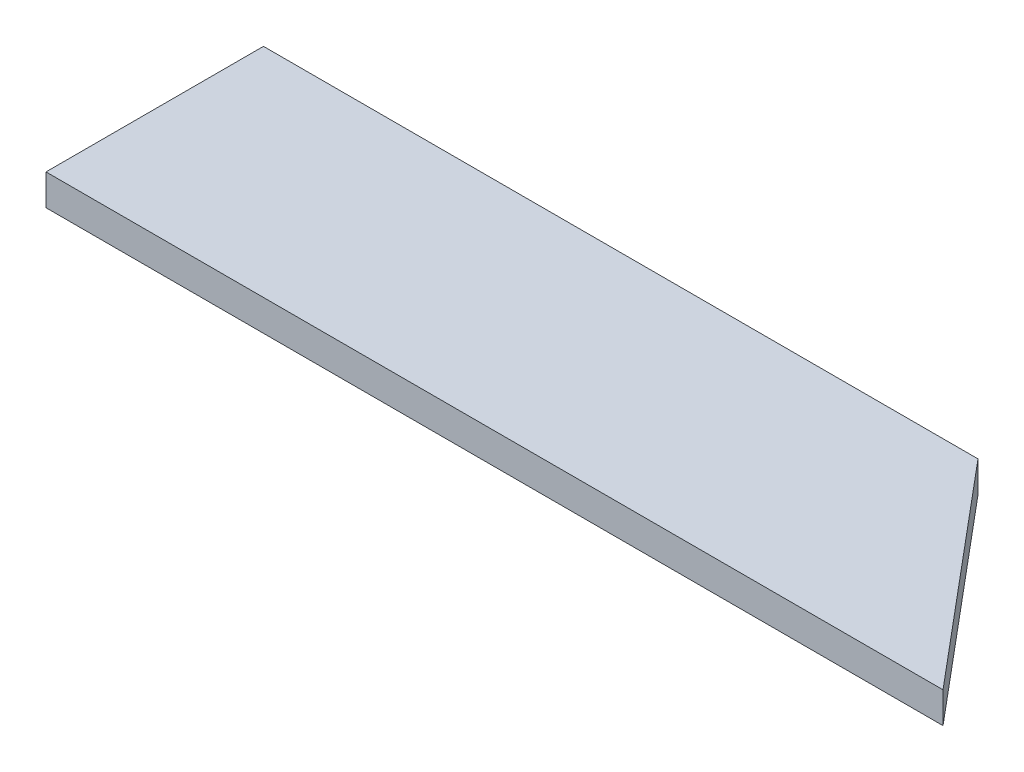
ISO-10303-21;
HEADER;
FILE_DESCRIPTION(('STEP AP214'),'2;1');
FILE_NAME('part.step','',(''),(''),'','','');
FILE_SCHEMA(('AUTOMOTIVE_DESIGN { 1 0 10303 214 1 1 1 1 }'));
ENDSEC;
DATA;
#1=APPLICATION_CONTEXT('core data for automotive mechanical design processes');
#2=APPLICATION_PROTOCOL_DEFINITION('international standard','automotive_design',2000,#1);
#3=PRODUCT_CONTEXT('',#1,'mechanical');
#4=PRODUCT('Part','Part','',(#3));
#5=PRODUCT_RELATED_PRODUCT_CATEGORY('part','',(#4));
#6=PRODUCT_DEFINITION_FORMATION('','',#4);
#7=PRODUCT_DEFINITION_CONTEXT('part definition',#1,'design');
#8=PRODUCT_DEFINITION('design','',#6,#7);
#9=PRODUCT_DEFINITION_SHAPE('','',#8);
#10=(LENGTH_UNIT() NAMED_UNIT(*) SI_UNIT(.MILLI.,.METRE.));
#11=(NAMED_UNIT(*) PLANE_ANGLE_UNIT() SI_UNIT($,.RADIAN.));
#12=(NAMED_UNIT(*) SI_UNIT($,.STERADIAN.) SOLID_ANGLE_UNIT());
#13=UNCERTAINTY_MEASURE_WITH_UNIT(LENGTH_MEASURE(1.E-05),#10,'distance_accuracy_value','');
#14=(GEOMETRIC_REPRESENTATION_CONTEXT(3) GLOBAL_UNCERTAINTY_ASSIGNED_CONTEXT((#13)) GLOBAL_UNIT_ASSIGNED_CONTEXT((#10,
#11,#12)) REPRESENTATION_CONTEXT('',''));
#15=CARTESIAN_POINT('',(0.,0.,0.));
#16=DIRECTION('',(0.,0.,1.));
#17=DIRECTION('',(1.,0.,0.));
#18=AXIS2_PLACEMENT_3D('',#15,#16,#17);
#19=CARTESIAN_POINT('',(-115.,10.,-35.));
#20=DIRECTION('',(0.,0.,1.));
#21=DIRECTION('',(1.,0.,0.));
#22=AXIS2_PLACEMENT_3D('',#19,#20,#21);
#23=PLANE('',#22);
#24=DIRECTION('',(-1.,0.,0.));
#25=VECTOR('',#24,1.);
#26=CARTESIAN_POINT('',(-115.,0.,-35.));
#27=LINE('',#26,#25);
#28=CARTESIAN_POINT('',(115.,0.,-35.));
#29=VERTEX_POINT('',#28);
#30=CARTESIAN_POINT('',(-115.,0.,-35.));
#31=VERTEX_POINT('',#30);
#32=EDGE_CURVE('E107',#29,#31,#27,.T.);
#33=ORIENTED_EDGE('',*,*,#32,.T.);
#34=DIRECTION('',(0.,-1.,0.));
#35=VECTOR('',#34,1.);
#36=CARTESIAN_POINT('',(-115.,10.,-35.));
#37=LINE('',#36,#35);
#38=CARTESIAN_POINT('',(-115.,10.,-35.));
#39=VERTEX_POINT('',#38);
#40=EDGE_CURVE('E11',#39,#31,#37,.T.);
#41=ORIENTED_EDGE('',*,*,#40,.F.);
#42=DIRECTION('',(-1.,0.,0.));
#43=VECTOR('',#42,1.);
#44=CARTESIAN_POINT('',(-115.,10.,-35.));
#45=LINE('',#44,#43);
#46=CARTESIAN_POINT('',(115.,10.,-35.));
#47=VERTEX_POINT('',#46);
#48=EDGE_CURVE('E90',#47,#39,#45,.T.);
#49=ORIENTED_EDGE('',*,*,#48,.F.);
#50=DIRECTION('',(0.,-1.,0.));
#51=VECTOR('',#50,1.);
#52=CARTESIAN_POINT('',(115.,10.,-35.));
#53=LINE('',#52,#51);
#54=EDGE_CURVE('E103',#47,#29,#53,.T.);
#55=ORIENTED_EDGE('',*,*,#54,.T.);
#56=EDGE_LOOP('',(#33,#41,#49,#55));
#57=FACE_BOUND('',#56,.T.);
#58=ADVANCED_FACE('F39',(#57),#23,.F.);
#59=CARTESIAN_POINT('',(-115.,10.,35.));
#60=DIRECTION('',(1.,0.,0.));
#61=DIRECTION('',(0.,0.,-1.));
#62=AXIS2_PLACEMENT_3D('',#59,#60,#61);
#63=PLANE('',#62);
#64=DIRECTION('',(0.,0.,1.));
#65=VECTOR('',#64,1.);
#66=CARTESIAN_POINT('',(-115.,0.,35.));
#67=LINE('',#66,#65);
#68=CARTESIAN_POINT('',(-115.,0.,35.));
#69=VERTEX_POINT('',#68);
#70=EDGE_CURVE('E96',#31,#69,#67,.T.);
#71=ORIENTED_EDGE('',*,*,#70,.T.);
#72=DIRECTION('',(0.,-1.,0.));
#73=VECTOR('',#72,1.);
#74=CARTESIAN_POINT('',(-115.,10.,35.));
#75=LINE('',#74,#73);
#76=CARTESIAN_POINT('',(-115.,10.,35.));
#77=VERTEX_POINT('',#76);
#78=EDGE_CURVE('E48',#77,#69,#75,.T.);
#79=ORIENTED_EDGE('',*,*,#78,.F.);
#80=DIRECTION('',(0.,0.,1.));
#81=VECTOR('',#80,1.);
#82=CARTESIAN_POINT('',(-115.,10.,35.));
#83=LINE('',#82,#81);
#84=EDGE_CURVE('E85',#39,#77,#83,.T.);
#85=ORIENTED_EDGE('',*,*,#84,.F.);
#86=ORIENTED_EDGE('',*,*,#40,.T.);
#87=EDGE_LOOP('',(#71,#79,#85,#86));
#88=FACE_BOUND('',#87,.T.);
#89=ADVANCED_FACE('F95',(#88),#63,.F.);
#90=CARTESIAN_POINT('',(173.73697418241,10.,35.));
#91=DIRECTION('',(0.,0.,-1.));
#92=DIRECTION('',(-1.,0.,0.));
#93=AXIS2_PLACEMENT_3D('',#90,#91,#92);
#94=PLANE('',#93);
#95=DIRECTION('',(1.,0.,0.));
#96=VECTOR('',#95,1.);
#97=CARTESIAN_POINT('',(173.73697418241,0.,35.));
#98=LINE('',#97,#96);
#99=CARTESIAN_POINT('',(173.73697418241,0.,35.));
#100=VERTEX_POINT('',#99);
#101=EDGE_CURVE('E72',#69,#100,#98,.T.);
#102=ORIENTED_EDGE('',*,*,#101,.T.);
#103=DIRECTION('',(0.,-1.,0.));
#104=VECTOR('',#103,1.);
#105=CARTESIAN_POINT('',(173.73697418241,10.,35.));
#106=LINE('',#105,#104);
#107=CARTESIAN_POINT('',(173.73697418241,10.,35.));
#108=VERTEX_POINT('',#107);
#109=EDGE_CURVE('E98',#108,#100,#106,.T.);
#110=ORIENTED_EDGE('',*,*,#109,.F.);
#111=DIRECTION('',(1.,0.,0.));
#112=VECTOR('',#111,1.);
#113=CARTESIAN_POINT('',(-115.,10.,35.));
#114=LINE('',#113,#112);
#115=EDGE_CURVE('E88',#77,#108,#114,.T.);
#116=ORIENTED_EDGE('',*,*,#115,.F.);
#117=ORIENTED_EDGE('',*,*,#78,.T.);
#118=EDGE_LOOP('',(#102,#110,#116,#117));
#119=FACE_BOUND('',#118,.T.);
#120=ADVANCED_FACE('F99',(#119),#94,.F.);
#121=CARTESIAN_POINT('',(115.,10.,-35.));
#122=DIRECTION('',(-0.766044443118974,0.,0.642787609686544));
#123=DIRECTION('',(0.642787609686544,0.,0.766044443118974));
#124=AXIS2_PLACEMENT_3D('',#121,#122,#123);
#125=PLANE('',#124);
#126=DIRECTION('',(-0.642787609686544,0.,-0.766044443118974));
#127=VECTOR('',#126,1.);
#128=CARTESIAN_POINT('',(115.,0.,-35.));
#129=LINE('',#128,#127);
#130=EDGE_CURVE('E78',#100,#29,#129,.T.);
#131=ORIENTED_EDGE('',*,*,#130,.T.);
#132=ORIENTED_EDGE('',*,*,#54,.F.);
#133=DIRECTION('',(-0.642787609686544,0.,-0.766044443118974));
#134=VECTOR('',#133,1.);
#135=CARTESIAN_POINT('',(115.,10.,-35.));
#136=LINE('',#135,#134);
#137=EDGE_CURVE('E56',#108,#47,#136,.T.);
#138=ORIENTED_EDGE('',*,*,#137,.F.);
#139=ORIENTED_EDGE('',*,*,#109,.T.);
#140=EDGE_LOOP('',(#131,#132,#138,#139));
#141=FACE_BOUND('',#140,.T.);
#142=ADVANCED_FACE('F120',(#141),#125,.F.);
#143=CARTESIAN_POINT('',(0.,10.,0.));
#144=DIRECTION('',(0.,1.,0.));
#145=DIRECTION('',(0.,0.,1.));
#146=AXIS2_PLACEMENT_3D('',#143,#144,#145);
#147=PLANE('',#146);
#148=ORIENTED_EDGE('',*,*,#48,.T.);
#149=ORIENTED_EDGE('',*,*,#84,.T.);
#150=ORIENTED_EDGE('',*,*,#115,.T.);
#151=ORIENTED_EDGE('',*,*,#137,.T.);
#152=EDGE_LOOP('',(#148,#149,#150,#151));
#153=FACE_BOUND('',#152,.T.);
#154=ADVANCED_FACE('F86',(#153),#147,.T.);
#155=CARTESIAN_POINT('',(0.,0.,0.));
#156=DIRECTION('',(0.,1.,0.));
#157=DIRECTION('',(0.,0.,1.));
#158=AXIS2_PLACEMENT_3D('',#155,#156,#157);
#159=PLANE('',#158);
#160=ORIENTED_EDGE('',*,*,#32,.F.);
#161=ORIENTED_EDGE('',*,*,#130,.F.);
#162=ORIENTED_EDGE('',*,*,#101,.F.);
#163=ORIENTED_EDGE('',*,*,#70,.F.);
#164=EDGE_LOOP('',(#160,#161,#162,#163));
#165=FACE_BOUND('',#164,.T.);
#166=ADVANCED_FACE('F123',(#165),#159,.F.);
#167=CLOSED_SHELL('',(#58,#89,#120,#142,#154,#166));
#168=MANIFOLD_SOLID_BREP('B2',#167);
#169=ADVANCED_BREP_SHAPE_REPRESENTATION('',(#18,#168),#14);
#170=SHAPE_DEFINITION_REPRESENTATION(#9,#169);
ENDSEC;
END-ISO-10303-21;
